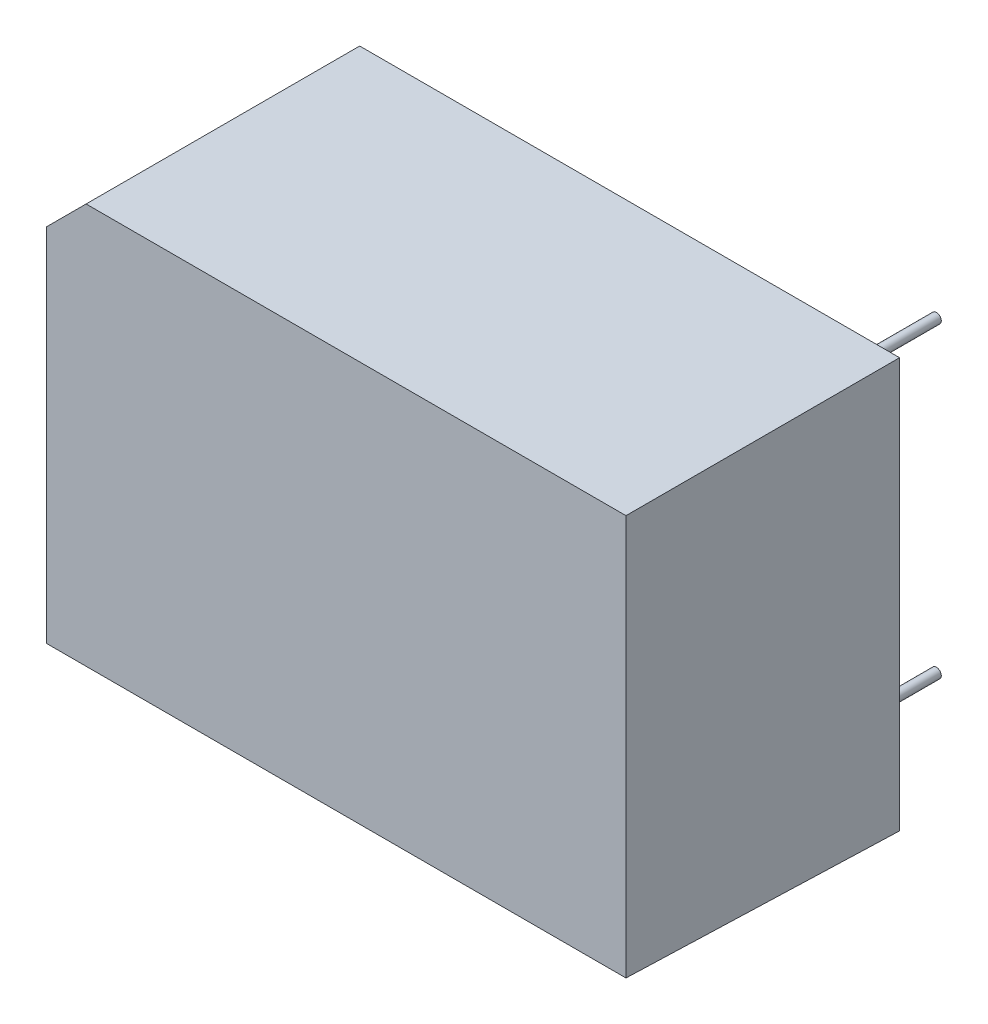
ISO-10303-21;
HEADER;
FILE_DESCRIPTION(('STEP AP214'),'2;1');
FILE_NAME('part.step','',(''),(''),'','','');
FILE_SCHEMA(('AUTOMOTIVE_DESIGN { 1 0 10303 214 1 1 1 1 }'));
ENDSEC;
DATA;
#1=APPLICATION_CONTEXT('core data for automotive mechanical design processes');
#2=APPLICATION_PROTOCOL_DEFINITION('international standard','automotive_design',2000,#1);
#3=PRODUCT_CONTEXT('',#1,'mechanical');
#4=PRODUCT('Part','Part','',(#3));
#5=PRODUCT_RELATED_PRODUCT_CATEGORY('part','',(#4));
#6=PRODUCT_DEFINITION_FORMATION('','',#4);
#7=PRODUCT_DEFINITION_CONTEXT('part definition',#1,'design');
#8=PRODUCT_DEFINITION('design','',#6,#7);
#9=PRODUCT_DEFINITION_SHAPE('','',#8);
#10=(LENGTH_UNIT() NAMED_UNIT(*) SI_UNIT(.MILLI.,.METRE.));
#11=(NAMED_UNIT(*) PLANE_ANGLE_UNIT() SI_UNIT($,.RADIAN.));
#12=(NAMED_UNIT(*) SI_UNIT($,.STERADIAN.) SOLID_ANGLE_UNIT());
#13=UNCERTAINTY_MEASURE_WITH_UNIT(LENGTH_MEASURE(1.E-05),#10,'distance_accuracy_value','');
#14=(GEOMETRIC_REPRESENTATION_CONTEXT(3) GLOBAL_UNCERTAINTY_ASSIGNED_CONTEXT((#13)) GLOBAL_UNIT_ASSIGNED_CONTEXT((#10,
#11,#12)) REPRESENTATION_CONTEXT('',''));
#15=CARTESIAN_POINT('',(0.,0.,0.));
#16=DIRECTION('',(0.,0.,1.));
#17=DIRECTION('',(1.,0.,0.));
#18=AXIS2_PLACEMENT_3D('',#15,#16,#17);
#19=CARTESIAN_POINT('',(-22.987,16.002,0.));
#20=DIRECTION('',(-0.999847695156391,0.,0.0174524064372835));
#21=DIRECTION('',(0.0174524064372835,0.,0.999847695156391));
#22=AXIS2_PLACEMENT_3D('',#19,#20,#21);
#23=PLANE('',#22);
#24=DIRECTION('',(0.,1.,0.));
#25=VECTOR('',#24,1.);
#26=CARTESIAN_POINT('',(-22.6204436365074,16.002,21.));
#27=LINE('',#26,#25);
#28=CARTESIAN_POINT('',(-22.6204436365074,12.5585563634926,21.));
#29=VERTEX_POINT('',#28);
#30=CARTESIAN_POINT('',(-22.6204436365074,-15.6354436365074,21.));
#31=VERTEX_POINT('',#30);
#32=EDGE_CURVE('E96',#29,#31,#27,.F.);
#33=ORIENTED_EDGE('',*,*,#32,.F.);
#34=DIRECTION('',(0.0174497491606827,0.0174497491606825,0.999695459881887));
#35=VECTOR('',#34,1.);
#36=CARTESIAN_POINT('',(-22.9858398788286,12.1931601211714,0.0664632973957655));
#37=LINE('',#36,#35);
#38=CARTESIAN_POINT('',(-22.987,12.192,0.));
#39=VERTEX_POINT('',#38);
#40=EDGE_CURVE('E83',#29,#39,#37,.F.);
#41=ORIENTED_EDGE('',*,*,#40,.T.);
#42=DIRECTION('',(0.,-1.,0.));
#43=VECTOR('',#42,1.);
#44=CARTESIAN_POINT('',(-22.987,16.002,0.));
#45=LINE('',#44,#43);
#46=CARTESIAN_POINT('',(-22.987,-16.002,0.));
#47=VERTEX_POINT('',#46);
#48=EDGE_CURVE('E94',#39,#47,#45,.T.);
#49=ORIENTED_EDGE('',*,*,#48,.T.);
#50=DIRECTION('',(-0.0174497491606827,-0.0174497491606827,-0.999695459881887));
#51=VECTOR('',#50,1.);
#52=CARTESIAN_POINT('',(-22.987,-16.002,0.));
#53=LINE('',#52,#51);
#54=EDGE_CURVE('E110',#31,#47,#53,.T.);
#55=ORIENTED_EDGE('',*,*,#54,.F.);
#56=EDGE_LOOP('',(#33,#41,#49,#55));
#57=FACE_BOUND('',#56,.T.);
#58=ADVANCED_FACE('F35',(#57),#23,.T.);
#59=CARTESIAN_POINT('',(-22.987,-16.002,0.));
#60=DIRECTION('',(0.,-0.999847695156391,0.0174524064372835));
#61=DIRECTION('',(0.,-0.0174524064372835,-0.999847695156391));
#62=AXIS2_PLACEMENT_3D('',#59,#60,#61);
#63=PLANE('',#62);
#64=DIRECTION('',(1.,0.,0.));
#65=VECTOR('',#64,1.);
#66=CARTESIAN_POINT('',(-22.987,-16.002,0.));
#67=LINE('',#66,#65);
#68=CARTESIAN_POINT('',(22.987,-16.002,0.));
#69=VERTEX_POINT('',#68);
#70=EDGE_CURVE('E100',#47,#69,#67,.T.);
#71=ORIENTED_EDGE('',*,*,#70,.T.);
#72=DIRECTION('',(0.0174497491606827,-0.0174497491606827,-0.999695459881887));
#73=VECTOR('',#72,1.);
#74=CARTESIAN_POINT('',(22.9772549821604,-15.9922549821604,0.558291698124441));
#75=LINE('',#74,#73);
#76=CARTESIAN_POINT('',(22.6204436365074,-15.6354436365074,21.));
#77=VERTEX_POINT('',#76);
#78=EDGE_CURVE('E113',#77,#69,#75,.T.);
#79=ORIENTED_EDGE('',*,*,#78,.F.);
#80=DIRECTION('',(-1.,0.,0.));
#81=VECTOR('',#80,1.);
#82=CARTESIAN_POINT('',(-22.987,-15.6354436365074,21.));
#83=LINE('',#82,#81);
#84=EDGE_CURVE('E121',#31,#77,#83,.F.);
#85=ORIENTED_EDGE('',*,*,#84,.F.);
#86=ORIENTED_EDGE('',*,*,#54,.T.);
#87=EDGE_LOOP('',(#71,#79,#85,#86));
#88=FACE_BOUND('',#87,.T.);
#89=ADVANCED_FACE('F37',(#88),#63,.T.);
#90=CARTESIAN_POINT('',(22.987,16.002,0.));
#91=DIRECTION('',(0.999847695156391,0.,0.0174524064372835));
#92=DIRECTION('',(0.0174524064372835,0.,-0.999847695156391));
#93=AXIS2_PLACEMENT_3D('',#90,#91,#92);
#94=PLANE('',#93);
#95=DIRECTION('',(0.,1.,0.));
#96=VECTOR('',#95,1.);
#97=CARTESIAN_POINT('',(22.987,16.002,0.));
#98=LINE('',#97,#96);
#99=CARTESIAN_POINT('',(22.987,16.002,0.));
#100=VERTEX_POINT('',#99);
#101=EDGE_CURVE('E103',#69,#100,#98,.T.);
#102=ORIENTED_EDGE('',*,*,#101,.T.);
#103=DIRECTION('',(0.0174497491606827,0.0174497491606827,-0.999695459881887));
#104=VECTOR('',#103,1.);
#105=CARTESIAN_POINT('',(22.9730012045319,15.9880012045319,0.801990455242253));
#106=LINE('',#105,#104);
#107=CARTESIAN_POINT('',(22.6204436365074,15.6354436365074,21.));
#108=VERTEX_POINT('',#107);
#109=EDGE_CURVE('E114',#108,#100,#106,.T.);
#110=ORIENTED_EDGE('',*,*,#109,.F.);
#111=DIRECTION('',(0.,-1.,0.));
#112=VECTOR('',#111,1.);
#113=CARTESIAN_POINT('',(22.6204436365074,16.002,21.));
#114=LINE('',#113,#112);
#115=EDGE_CURVE('E58',#77,#108,#114,.F.);
#116=ORIENTED_EDGE('',*,*,#115,.F.);
#117=ORIENTED_EDGE('',*,*,#78,.T.);
#118=EDGE_LOOP('',(#102,#110,#116,#117));
#119=FACE_BOUND('',#118,.T.);
#120=ADVANCED_FACE('F162',(#119),#94,.T.);
#121=CARTESIAN_POINT('',(-22.987,16.002,0.));
#122=DIRECTION('',(0.,0.999847695156391,0.0174524064372835));
#123=DIRECTION('',(0.,-0.0174524064372835,0.999847695156391));
#124=AXIS2_PLACEMENT_3D('',#121,#122,#123);
#125=PLANE('',#124);
#126=DIRECTION('',(-1.,0.,0.));
#127=VECTOR('',#126,1.);
#128=CARTESIAN_POINT('',(-22.987,16.002,0.));
#129=LINE('',#128,#127);
#130=CARTESIAN_POINT('',(-19.177,16.002,0.));
#131=VERTEX_POINT('',#130);
#132=EDGE_CURVE('E108',#100,#131,#129,.T.);
#133=ORIENTED_EDGE('',*,*,#132,.T.);
#134=DIRECTION('',(0.0174497491606829,0.0174497491606827,-0.999695459881887));
#135=VECTOR('',#134,1.);
#136=CARTESIAN_POINT('',(-19.1781601211714,16.0008398788286,0.0664632973957675));
#137=LINE('',#136,#135);
#138=CARTESIAN_POINT('',(-19.5435563634926,15.6354436365074,21.));
#139=VERTEX_POINT('',#138);
#140=EDGE_CURVE('E50',#131,#139,#137,.F.);
#141=ORIENTED_EDGE('',*,*,#140,.T.);
#142=DIRECTION('',(1.,0.,0.));
#143=VECTOR('',#142,1.);
#144=CARTESIAN_POINT('',(-22.987,15.6354436365074,21.));
#145=LINE('',#144,#143);
#146=EDGE_CURVE('E117',#108,#139,#145,.F.);
#147=ORIENTED_EDGE('',*,*,#146,.F.);
#148=ORIENTED_EDGE('',*,*,#109,.T.);
#149=EDGE_LOOP('',(#133,#141,#147,#148));
#150=FACE_BOUND('',#149,.T.);
#151=ADVANCED_FACE('F166',(#150),#125,.T.);
#152=CARTESIAN_POINT('',(0.,0.,21.));
#153=DIRECTION('',(0.,0.,1.));
#154=DIRECTION('',(1.,0.,0.));
#155=AXIS2_PLACEMENT_3D('',#152,#153,#154);
#156=PLANE('',#155);
#157=DIRECTION('',(0.707106781186551,0.707106781186544,0.));
#158=VECTOR('',#157,1.);
#159=CARTESIAN_POINT('',(-22.987,12.192,21.));
#160=LINE('',#159,#158);
#161=EDGE_CURVE('E89',#29,#139,#160,.T.);
#162=ORIENTED_EDGE('',*,*,#161,.F.);
#163=ORIENTED_EDGE('',*,*,#32,.T.);
#164=ORIENTED_EDGE('',*,*,#84,.T.);
#165=ORIENTED_EDGE('',*,*,#115,.T.);
#166=ORIENTED_EDGE('',*,*,#146,.T.);
#167=EDGE_LOOP('',(#162,#163,#164,#165,#166));
#168=FACE_BOUND('',#167,.T.);
#169=ADVANCED_FACE('F136',(#168),#156,.T.);
#170=CARTESIAN_POINT('',(0.,0.,0.));
#171=DIRECTION('',(0.,0.,1.));
#172=DIRECTION('',(1.,0.,0.));
#173=AXIS2_PLACEMENT_3D('',#170,#171,#172);
#174=PLANE('',#173);
#175=CARTESIAN_POINT('',(17.737,-12.002,0.));
#176=DIRECTION('',(0.,0.,1.));
#177=DIRECTION('',(1.,0.,0.));
#178=AXIS2_PLACEMENT_3D('',#175,#176,#177);
#179=CIRCLE('',#178,0.380999999999998);
#180=CARTESIAN_POINT('',(18.118,-12.002,0.));
#181=VERTEX_POINT('',#180);
#182=EDGE_CURVE('E11',#181,#181,#179,.F.);
#183=ORIENTED_EDGE('',*,*,#182,.F.);
#184=EDGE_LOOP('',(#183));
#185=FACE_BOUND('',#184,.T.);
#186=CARTESIAN_POINT('',(-17.763,-12.002,0.));
#187=DIRECTION('',(0.,0.,1.));
#188=DIRECTION('',(1.,0.,0.));
#189=AXIS2_PLACEMENT_3D('',#186,#187,#188);
#190=CIRCLE('',#189,0.380999999999998);
#191=CARTESIAN_POINT('',(-17.382,-12.002,0.));
#192=VERTEX_POINT('',#191);
#193=EDGE_CURVE('E43',#192,#192,#190,.F.);
#194=ORIENTED_EDGE('',*,*,#193,.F.);
#195=EDGE_LOOP('',(#194));
#196=FACE_BOUND('',#195,.T.);
#197=CARTESIAN_POINT('',(-17.763,3.998,0.));
#198=DIRECTION('',(0.,0.,1.));
#199=DIRECTION('',(1.,0.,0.));
#200=AXIS2_PLACEMENT_3D('',#197,#198,#199);
#201=CIRCLE('',#200,0.380999999999998);
#202=CARTESIAN_POINT('',(-17.382,3.998,0.));
#203=VERTEX_POINT('',#202);
#204=EDGE_CURVE('E127',#203,#203,#201,.F.);
#205=ORIENTED_EDGE('',*,*,#204,.F.);
#206=EDGE_LOOP('',(#205));
#207=FACE_BOUND('',#206,.T.);
#208=CARTESIAN_POINT('',(17.737,11.998,0.));
#209=DIRECTION('',(0.,0.,1.));
#210=DIRECTION('',(1.,0.,0.));
#211=AXIS2_PLACEMENT_3D('',#208,#209,#210);
#212=CIRCLE('',#211,0.380999999999998);
#213=CARTESIAN_POINT('',(18.118,11.998,0.));
#214=VERTEX_POINT('',#213);
#215=EDGE_CURVE('E112',#214,#214,#212,.F.);
#216=ORIENTED_EDGE('',*,*,#215,.F.);
#217=EDGE_LOOP('',(#216));
#218=FACE_BOUND('',#217,.T.);
#219=ORIENTED_EDGE('',*,*,#48,.F.);
#220=DIRECTION('',(0.707106781186551,0.707106781186544,0.));
#221=VECTOR('',#220,1.);
#222=CARTESIAN_POINT('',(-22.987,12.192,0.));
#223=LINE('',#222,#221);
#224=EDGE_CURVE('E80',#39,#131,#223,.T.);
#225=ORIENTED_EDGE('',*,*,#224,.T.);
#226=ORIENTED_EDGE('',*,*,#132,.F.);
#227=ORIENTED_EDGE('',*,*,#101,.F.);
#228=ORIENTED_EDGE('',*,*,#70,.F.);
#229=EDGE_LOOP('',(#219,#225,#226,#227,#228));
#230=FACE_BOUND('',#229,.T.);
#231=ADVANCED_FACE('F98',(#185,#196,#207,#218,#230),#174,.F.);
#232=CARTESIAN_POINT('',(-22.987,12.192,0.));
#233=DIRECTION('',(0.707106781186544,-0.707106781186551,0.));
#234=DIRECTION('',(0.707106781186551,0.707106781186544,0.));
#235=AXIS2_PLACEMENT_3D('',#232,#233,#234);
#236=PLANE('',#235);
#237=ORIENTED_EDGE('',*,*,#161,.T.);
#238=ORIENTED_EDGE('',*,*,#140,.F.);
#239=ORIENTED_EDGE('',*,*,#224,.F.);
#240=ORIENTED_EDGE('',*,*,#40,.F.);
#241=EDGE_LOOP('',(#237,#238,#239,#240));
#242=FACE_BOUND('',#241,.T.);
#243=ADVANCED_FACE('F82',(#242),#236,.F.);
#244=CARTESIAN_POINT('',(17.737,11.998,-8.128));
#245=DIRECTION('',(0.,0.,1.));
#246=DIRECTION('',(1.,0.,0.));
#247=AXIS2_PLACEMENT_3D('',#244,#245,#246);
#248=CYLINDRICAL_SURFACE('',#247,0.380999999999998);
#249=CARTESIAN_POINT('',(17.737,11.998,-8.128));
#250=DIRECTION('',(0.,0.,-1.));
#251=DIRECTION('',(-1.,0.,0.));
#252=AXIS2_PLACEMENT_3D('',#249,#250,#251);
#253=CIRCLE('',#252,0.380999999999998);
#254=CARTESIAN_POINT('',(17.356,11.998,-8.128));
#255=VERTEX_POINT('',#254);
#256=EDGE_CURVE('E176',#255,#255,#253,.T.);
#257=ORIENTED_EDGE('',*,*,#256,.F.);
#258=EDGE_LOOP('',(#257));
#259=FACE_BOUND('',#258,.T.);
#260=ORIENTED_EDGE('',*,*,#215,.T.);
#261=EDGE_LOOP('',(#260));
#262=FACE_BOUND('',#261,.T.);
#263=ADVANCED_FACE('F143',(#259,#262),#248,.T.);
#264=CARTESIAN_POINT('',(17.737,11.998,-8.128));
#265=DIRECTION('',(0.,0.,-1.));
#266=DIRECTION('',(-1.,0.,0.));
#267=AXIS2_PLACEMENT_3D('',#264,#265,#266);
#268=PLANE('',#267);
#269=ORIENTED_EDGE('',*,*,#256,.T.);
#270=EDGE_LOOP('',(#269));
#271=FACE_BOUND('',#270,.T.);
#272=ADVANCED_FACE('F145',(#271),#268,.T.);
#273=CARTESIAN_POINT('',(-17.763,3.998,-8.128));
#274=DIRECTION('',(0.,0.,1.));
#275=DIRECTION('',(1.,0.,0.));
#276=AXIS2_PLACEMENT_3D('',#273,#274,#275);
#277=CYLINDRICAL_SURFACE('',#276,0.380999999999998);
#278=CARTESIAN_POINT('',(-17.763,3.998,-8.128));
#279=DIRECTION('',(0.,0.,-1.));
#280=DIRECTION('',(-1.,0.,0.));
#281=AXIS2_PLACEMENT_3D('',#278,#279,#280);
#282=CIRCLE('',#281,0.380999999999998);
#283=CARTESIAN_POINT('',(-18.144,3.998,-8.128));
#284=VERTEX_POINT('',#283);
#285=EDGE_CURVE('E179',#284,#284,#282,.T.);
#286=ORIENTED_EDGE('',*,*,#285,.F.);
#287=EDGE_LOOP('',(#286));
#288=FACE_BOUND('',#287,.T.);
#289=ORIENTED_EDGE('',*,*,#204,.T.);
#290=EDGE_LOOP('',(#289));
#291=FACE_BOUND('',#290,.T.);
#292=ADVANCED_FACE('F152',(#288,#291),#277,.T.);
#293=CARTESIAN_POINT('',(-17.763,3.998,-8.128));
#294=DIRECTION('',(0.,0.,-1.));
#295=DIRECTION('',(-1.,0.,0.));
#296=AXIS2_PLACEMENT_3D('',#293,#294,#295);
#297=PLANE('',#296);
#298=ORIENTED_EDGE('',*,*,#285,.T.);
#299=EDGE_LOOP('',(#298));
#300=FACE_BOUND('',#299,.T.);
#301=ADVANCED_FACE('F209',(#300),#297,.T.);
#302=CARTESIAN_POINT('',(-17.763,-12.002,-8.128));
#303=DIRECTION('',(0.,0.,1.));
#304=DIRECTION('',(1.,0.,0.));
#305=AXIS2_PLACEMENT_3D('',#302,#303,#304);
#306=CYLINDRICAL_SURFACE('',#305,0.380999999999998);
#307=CARTESIAN_POINT('',(-17.763,-12.002,-8.128));
#308=DIRECTION('',(0.,0.,-1.));
#309=DIRECTION('',(-1.,0.,0.));
#310=AXIS2_PLACEMENT_3D('',#307,#308,#309);
#311=CIRCLE('',#310,0.380999999999998);
#312=CARTESIAN_POINT('',(-18.144,-12.002,-8.128));
#313=VERTEX_POINT('',#312);
#314=EDGE_CURVE('E184',#313,#313,#311,.T.);
#315=ORIENTED_EDGE('',*,*,#314,.F.);
#316=EDGE_LOOP('',(#315));
#317=FACE_BOUND('',#316,.T.);
#318=ORIENTED_EDGE('',*,*,#193,.T.);
#319=EDGE_LOOP('',(#318));
#320=FACE_BOUND('',#319,.T.);
#321=ADVANCED_FACE('F132',(#317,#320),#306,.T.);
#322=CARTESIAN_POINT('',(-17.763,-12.002,-8.128));
#323=DIRECTION('',(0.,0.,-1.));
#324=DIRECTION('',(-1.,0.,0.));
#325=AXIS2_PLACEMENT_3D('',#322,#323,#324);
#326=PLANE('',#325);
#327=ORIENTED_EDGE('',*,*,#314,.T.);
#328=EDGE_LOOP('',(#327));
#329=FACE_BOUND('',#328,.T.);
#330=ADVANCED_FACE('F196',(#329),#326,.T.);
#331=CARTESIAN_POINT('',(17.737,-12.002,-8.128));
#332=DIRECTION('',(0.,0.,1.));
#333=DIRECTION('',(1.,0.,0.));
#334=AXIS2_PLACEMENT_3D('',#331,#332,#333);
#335=CYLINDRICAL_SURFACE('',#334,0.380999999999998);
#336=CARTESIAN_POINT('',(17.737,-12.002,-8.128));
#337=DIRECTION('',(0.,0.,-1.));
#338=DIRECTION('',(-1.,0.,0.));
#339=AXIS2_PLACEMENT_3D('',#336,#337,#338);
#340=CIRCLE('',#339,0.380999999999998);
#341=CARTESIAN_POINT('',(17.356,-12.002,-8.128));
#342=VERTEX_POINT('',#341);
#343=EDGE_CURVE('E187',#342,#342,#340,.T.);
#344=ORIENTED_EDGE('',*,*,#343,.F.);
#345=EDGE_LOOP('',(#344));
#346=FACE_BOUND('',#345,.T.);
#347=ORIENTED_EDGE('',*,*,#182,.T.);
#348=EDGE_LOOP('',(#347));
#349=FACE_BOUND('',#348,.T.);
#350=ADVANCED_FACE('F193',(#346,#349),#335,.T.);
#351=CARTESIAN_POINT('',(17.737,-12.002,-8.128));
#352=DIRECTION('',(0.,0.,-1.));
#353=DIRECTION('',(-1.,0.,0.));
#354=AXIS2_PLACEMENT_3D('',#351,#352,#353);
#355=PLANE('',#354);
#356=ORIENTED_EDGE('',*,*,#343,.T.);
#357=EDGE_LOOP('',(#356));
#358=FACE_BOUND('',#357,.T.);
#359=ADVANCED_FACE('F191',(#358),#355,.T.);
#360=CLOSED_SHELL('',(#58,#89,#120,#151,#169,#231,#243,#263,#272,#292,#301,#321,#330,#350,#359));
#361=MANIFOLD_SOLID_BREP('B2',#360);
#362=ADVANCED_BREP_SHAPE_REPRESENTATION('',(#18,#361),#14);
#363=SHAPE_DEFINITION_REPRESENTATION(#9,#362);
ENDSEC;
END-ISO-10303-21;
